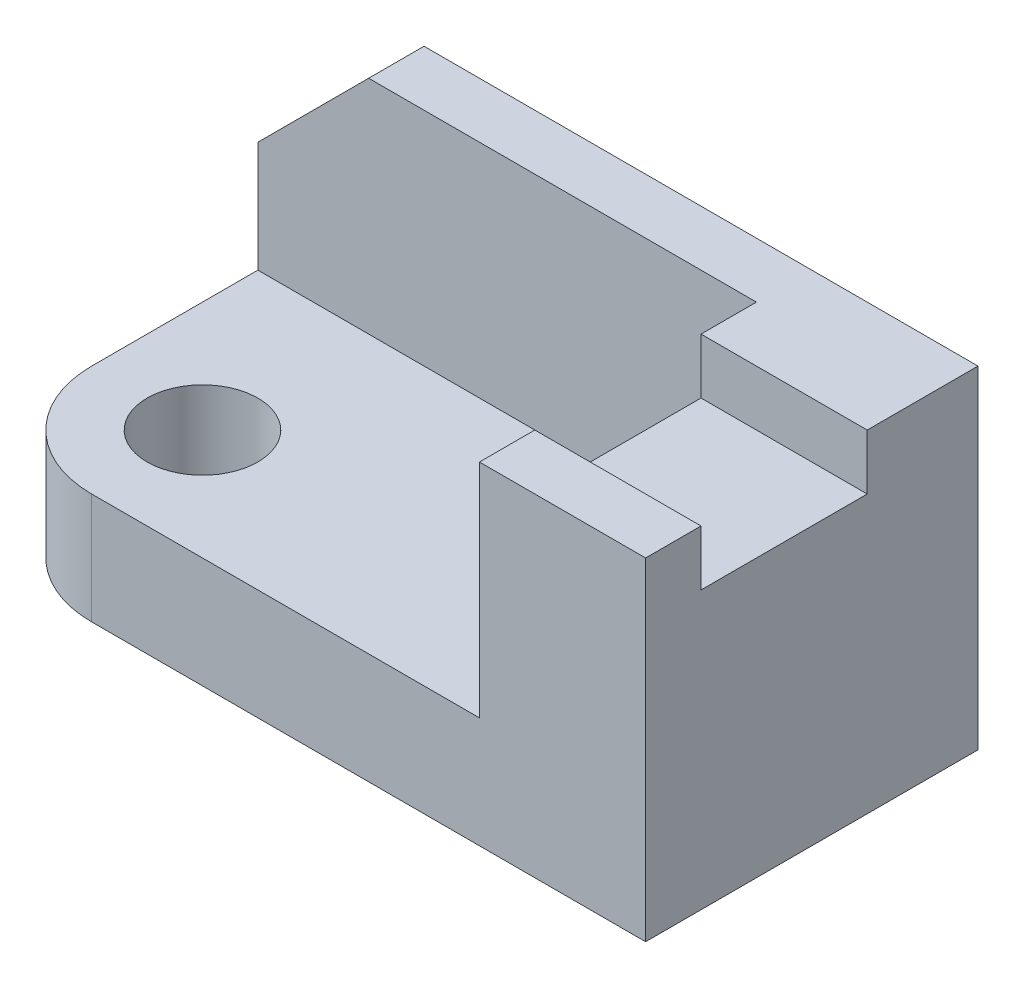
ISO-10303-21;
HEADER;
FILE_DESCRIPTION(('STEP AP214'),'2;1');
FILE_NAME('part.step','',(''),(''),'','','');
FILE_SCHEMA(('AUTOMOTIVE_DESIGN { 1 0 10303 214 1 1 1 1 }'));
ENDSEC;
DATA;
#1=APPLICATION_CONTEXT('core data for automotive mechanical design processes');
#2=APPLICATION_PROTOCOL_DEFINITION('international standard','automotive_design',2000,#1);
#3=PRODUCT_CONTEXT('',#1,'mechanical');
#4=PRODUCT('Part','Part','',(#3));
#5=PRODUCT_RELATED_PRODUCT_CATEGORY('part','',(#4));
#6=PRODUCT_DEFINITION_FORMATION('','',#4);
#7=PRODUCT_DEFINITION_CONTEXT('part definition',#1,'design');
#8=PRODUCT_DEFINITION('design','',#6,#7);
#9=PRODUCT_DEFINITION_SHAPE('','',#8);
#10=(LENGTH_UNIT() NAMED_UNIT(*) SI_UNIT(.MILLI.,.METRE.));
#11=(NAMED_UNIT(*) PLANE_ANGLE_UNIT() SI_UNIT($,.RADIAN.));
#12=(NAMED_UNIT(*) SI_UNIT($,.STERADIAN.) SOLID_ANGLE_UNIT());
#13=UNCERTAINTY_MEASURE_WITH_UNIT(LENGTH_MEASURE(1.E-05),#10,'distance_accuracy_value','');
#14=(GEOMETRIC_REPRESENTATION_CONTEXT(3) GLOBAL_UNCERTAINTY_ASSIGNED_CONTEXT((#13)) GLOBAL_UNIT_ASSIGNED_CONTEXT((#10,
#11,#12)) REPRESENTATION_CONTEXT('',''));
#15=CARTESIAN_POINT('',(0.,0.,0.));
#16=DIRECTION('',(0.,0.,1.));
#17=DIRECTION('',(1.,0.,0.));
#18=AXIS2_PLACEMENT_3D('',#15,#16,#17);
#19=CARTESIAN_POINT('',(0.,40.,0.));
#20=DIRECTION('',(0.,1.,0.));
#21=DIRECTION('',(0.,0.,1.));
#22=AXIS2_PLACEMENT_3D('',#19,#20,#21);
#23=PLANE('',#22);
#24=DIRECTION('',(-1.,0.,0.));
#25=VECTOR('',#24,1.);
#26=CARTESIAN_POINT('',(-30.,40.,20.));
#27=LINE('',#26,#25);
#28=CARTESIAN_POINT('',(0.,40.,20.));
#29=VERTEX_POINT('',#28);
#30=CARTESIAN_POINT('',(-30.,40.,20.));
#31=VERTEX_POINT('',#30);
#32=EDGE_CURVE('E151',#29,#31,#27,.T.);
#33=ORIENTED_EDGE('',*,*,#32,.F.);
#34=DIRECTION('',(0.,0.,-1.));
#35=VECTOR('',#34,1.);
#36=CARTESIAN_POINT('',(0.,40.,0.));
#37=LINE('',#36,#35);
#38=CARTESIAN_POINT('',(0.,40.,0.));
#39=VERTEX_POINT('',#38);
#40=EDGE_CURVE('E172',#29,#39,#37,.T.);
#41=ORIENTED_EDGE('',*,*,#40,.T.);
#42=DIRECTION('',(-1.,0.,0.));
#43=VECTOR('',#42,1.);
#44=CARTESIAN_POINT('',(-120.,40.,0.));
#45=LINE('',#44,#43);
#46=CARTESIAN_POINT('',(-100.,40.,0.));
#47=VERTEX_POINT('',#46);
#48=EDGE_CURVE('E176',#39,#47,#45,.T.);
#49=ORIENTED_EDGE('',*,*,#48,.T.);
#50=DIRECTION('',(0.,0.,1.));
#51=VECTOR('',#50,1.);
#52=CARTESIAN_POINT('',(-100.,40.,0.));
#53=LINE('',#52,#51);
#54=CARTESIAN_POINT('',(-100.,40.,10.));
#55=VERTEX_POINT('',#54);
#56=EDGE_CURVE('E225',#47,#55,#53,.T.);
#57=ORIENTED_EDGE('',*,*,#56,.T.);
#58=DIRECTION('',(1.,0.,0.));
#59=VECTOR('',#58,1.);
#60=CARTESIAN_POINT('',(-120.,40.,10.));
#61=LINE('',#60,#59);
#62=CARTESIAN_POINT('',(-30.,40.,10.));
#63=VERTEX_POINT('',#62);
#64=EDGE_CURVE('E163',#55,#63,#61,.T.);
#65=ORIENTED_EDGE('',*,*,#64,.T.);
#66=DIRECTION('',(0.,0.,1.));
#67=VECTOR('',#66,1.);
#68=CARTESIAN_POINT('',(-30.,40.,10.));
#69=LINE('',#68,#67);
#70=EDGE_CURVE('E166',#63,#31,#69,.T.);
#71=ORIENTED_EDGE('',*,*,#70,.T.);
#72=EDGE_LOOP('',(#33,#41,#49,#57,#65,#71));
#73=FACE_BOUND('',#72,.T.);
#74=ADVANCED_FACE('F41',(#73),#23,.T.);
#75=CARTESIAN_POINT('',(0.,0.,0.));
#76=DIRECTION('',(0.,-1.,0.));
#77=DIRECTION('',(0.,0.,-1.));
#78=AXIS2_PLACEMENT_3D('',#75,#76,#77);
#79=PLANE('',#78);
#80=CARTESIAN_POINT('',(-100.,0.,40.));
#81=DIRECTION('',(0.,1.,0.));
#82=DIRECTION('',(0.,0.,1.));
#83=AXIS2_PLACEMENT_3D('',#80,#81,#82);
#84=CIRCLE('',#83,9.99999999999999);
#85=CARTESIAN_POINT('',(-100.,0.,50.));
#86=VERTEX_POINT('',#85);
#87=EDGE_CURVE('E275',#86,#86,#84,.T.);
#88=ORIENTED_EDGE('',*,*,#87,.F.);
#89=EDGE_LOOP('',(#88));
#90=FACE_BOUND('',#89,.T.);
#91=DIRECTION('',(0.,0.,1.));
#92=VECTOR('',#91,1.);
#93=CARTESIAN_POINT('',(-120.,0.,0.));
#94=LINE('',#93,#92);
#95=CARTESIAN_POINT('',(-120.,0.,10.));
#96=VERTEX_POINT('',#95);
#97=CARTESIAN_POINT('',(-120.,0.,40.));
#98=VERTEX_POINT('',#97);
#99=EDGE_CURVE('E193',#96,#98,#94,.T.);
#100=ORIENTED_EDGE('',*,*,#99,.T.);
#101=CARTESIAN_POINT('',(-100.,0.,40.));
#102=DIRECTION('',(0.,-1.,0.));
#103=DIRECTION('',(0.,0.,-1.));
#104=AXIS2_PLACEMENT_3D('',#101,#102,#103);
#105=CIRCLE('',#104,20.);
#106=CARTESIAN_POINT('',(-100.,0.,60.));
#107=VERTEX_POINT('',#106);
#108=EDGE_CURVE('E219',#98,#107,#105,.F.);
#109=ORIENTED_EDGE('',*,*,#108,.T.);
#110=DIRECTION('',(1.,0.,0.));
#111=VECTOR('',#110,1.);
#112=CARTESIAN_POINT('',(0.,0.,60.));
#113=LINE('',#112,#111);
#114=CARTESIAN_POINT('',(-30.,0.,60.));
#115=VERTEX_POINT('',#114);
#116=EDGE_CURVE('E198',#107,#115,#113,.T.);
#117=ORIENTED_EDGE('',*,*,#116,.T.);
#118=DIRECTION('',(0.,0.,1.));
#119=VECTOR('',#118,1.);
#120=CARTESIAN_POINT('',(-30.,0.,10.));
#121=LINE('',#120,#119);
#122=CARTESIAN_POINT('',(-30.,0.,10.));
#123=VERTEX_POINT('',#122);
#124=EDGE_CURVE('E165',#123,#115,#121,.T.);
#125=ORIENTED_EDGE('',*,*,#124,.F.);
#126=DIRECTION('',(1.,0.,0.));
#127=VECTOR('',#126,1.);
#128=CARTESIAN_POINT('',(-120.,0.,10.));
#129=LINE('',#128,#127);
#130=EDGE_CURVE('E180',#96,#123,#129,.T.);
#131=ORIENTED_EDGE('',*,*,#130,.F.);
#132=EDGE_LOOP('',(#100,#109,#117,#125,#131));
#133=FACE_BOUND('',#132,.T.);
#134=ADVANCED_FACE('F262',(#90,#133),#79,.F.);
#135=CARTESIAN_POINT('',(0.,-20.,0.));
#136=DIRECTION('',(1.,0.,0.));
#137=DIRECTION('',(0.,0.,-1.));
#138=AXIS2_PLACEMENT_3D('',#135,#136,#137);
#139=PLANE('',#138);
#140=DIRECTION('',(0.,1.,0.));
#141=VECTOR('',#140,1.);
#142=CARTESIAN_POINT('',(0.,30.,20.));
#143=LINE('',#142,#141);
#144=CARTESIAN_POINT('',(0.,30.,20.));
#145=VERTEX_POINT('',#144);
#146=EDGE_CURVE('E158',#145,#29,#143,.T.);
#147=ORIENTED_EDGE('',*,*,#146,.F.);
#148=DIRECTION('',(0.,0.,-1.));
#149=VECTOR('',#148,1.);
#150=CARTESIAN_POINT('',(0.,30.,20.));
#151=LINE('',#150,#149);
#152=CARTESIAN_POINT('',(0.,30.,50.));
#153=VERTEX_POINT('',#152);
#154=EDGE_CURVE('E141',#153,#145,#151,.T.);
#155=ORIENTED_EDGE('',*,*,#154,.F.);
#156=DIRECTION('',(0.,1.,0.));
#157=VECTOR('',#156,1.);
#158=CARTESIAN_POINT('',(0.,30.,50.));
#159=LINE('',#158,#157);
#160=CARTESIAN_POINT('',(0.,40.,50.));
#161=VERTEX_POINT('',#160);
#162=EDGE_CURVE('E138',#153,#161,#159,.T.);
#163=ORIENTED_EDGE('',*,*,#162,.T.);
#164=CARTESIAN_POINT('',(0.,40.,60.));
#165=VERTEX_POINT('',#164);
#166=EDGE_CURVE('E173',#165,#161,#37,.T.);
#167=ORIENTED_EDGE('',*,*,#166,.F.);
#168=DIRECTION('',(0.,1.,0.));
#169=VECTOR('',#168,1.);
#170=CARTESIAN_POINT('',(0.,-20.,60.));
#171=LINE('',#170,#169);
#172=CARTESIAN_POINT('',(0.,-20.,60.));
#173=VERTEX_POINT('',#172);
#174=EDGE_CURVE('E210',#173,#165,#171,.T.);
#175=ORIENTED_EDGE('',*,*,#174,.F.);
#176=DIRECTION('',(0.,0.,-1.));
#177=VECTOR('',#176,1.);
#178=CARTESIAN_POINT('',(0.,-20.,0.));
#179=LINE('',#178,#177);
#180=CARTESIAN_POINT('',(0.,-20.,0.));
#181=VERTEX_POINT('',#180);
#182=EDGE_CURVE('E194',#173,#181,#179,.T.);
#183=ORIENTED_EDGE('',*,*,#182,.T.);
#184=DIRECTION('',(0.,1.,0.));
#185=VECTOR('',#184,1.);
#186=CARTESIAN_POINT('',(0.,-20.,0.));
#187=LINE('',#186,#185);
#188=EDGE_CURVE('E206',#181,#39,#187,.T.);
#189=ORIENTED_EDGE('',*,*,#188,.T.);
#190=ORIENTED_EDGE('',*,*,#40,.F.);
#191=EDGE_LOOP('',(#147,#155,#163,#167,#175,#183,#189,#190));
#192=FACE_BOUND('',#191,.T.);
#193=ADVANCED_FACE('F247',(#192),#139,.T.);
#194=CARTESIAN_POINT('',(0.,-20.,60.));
#195=DIRECTION('',(0.,0.,1.));
#196=DIRECTION('',(1.,0.,0.));
#197=AXIS2_PLACEMENT_3D('',#194,#195,#196);
#198=PLANE('',#197);
#199=ORIENTED_EDGE('',*,*,#116,.F.);
#200=DIRECTION('',(0.,1.,0.));
#201=VECTOR('',#200,1.);
#202=CARTESIAN_POINT('',(-100.,-20.,60.));
#203=LINE('',#202,#201);
#204=CARTESIAN_POINT('',(-100.,-20.,60.));
#205=VERTEX_POINT('',#204);
#206=EDGE_CURVE('E221',#107,#205,#203,.F.);
#207=ORIENTED_EDGE('',*,*,#206,.T.);
#208=DIRECTION('',(1.,0.,0.));
#209=VECTOR('',#208,1.);
#210=CARTESIAN_POINT('',(0.,-20.,60.));
#211=LINE('',#210,#209);
#212=EDGE_CURVE('E204',#205,#173,#211,.T.);
#213=ORIENTED_EDGE('',*,*,#212,.T.);
#214=ORIENTED_EDGE('',*,*,#174,.T.);
#215=DIRECTION('',(1.,0.,0.));
#216=VECTOR('',#215,1.);
#217=CARTESIAN_POINT('',(-30.,40.,60.));
#218=LINE('',#217,#216);
#219=CARTESIAN_POINT('',(-30.,40.,60.));
#220=VERTEX_POINT('',#219);
#221=EDGE_CURVE('E169',#220,#165,#218,.T.);
#222=ORIENTED_EDGE('',*,*,#221,.F.);
#223=DIRECTION('',(0.,-1.,0.));
#224=VECTOR('',#223,1.);
#225=CARTESIAN_POINT('',(-30.,40.,60.));
#226=LINE('',#225,#224);
#227=EDGE_CURVE('E179',#220,#115,#226,.T.);
#228=ORIENTED_EDGE('',*,*,#227,.T.);
#229=EDGE_LOOP('',(#199,#207,#213,#214,#222,#228));
#230=FACE_BOUND('',#229,.T.);
#231=ADVANCED_FACE('F264',(#230),#198,.T.);
#232=CARTESIAN_POINT('',(-120.,-20.,0.));
#233=DIRECTION('',(-1.,0.,0.));
#234=DIRECTION('',(0.,0.,1.));
#235=AXIS2_PLACEMENT_3D('',#232,#233,#234);
#236=PLANE('',#235);
#237=DIRECTION('',(0.,-1.,0.));
#238=VECTOR('',#237,1.);
#239=CARTESIAN_POINT('',(-120.,40.,10.));
#240=LINE('',#239,#238);
#241=CARTESIAN_POINT('',(-120.,19.9999999999999,10.));
#242=VERTEX_POINT('',#241);
#243=EDGE_CURVE('E191',#242,#96,#240,.T.);
#244=ORIENTED_EDGE('',*,*,#243,.F.);
#245=DIRECTION('',(0.,0.,-1.));
#246=VECTOR('',#245,1.);
#247=CARTESIAN_POINT('',(-120.,19.9999999999999,0.));
#248=LINE('',#247,#246);
#249=CARTESIAN_POINT('',(-120.,19.9999999999999,0.));
#250=VERTEX_POINT('',#249);
#251=EDGE_CURVE('E50',#242,#250,#248,.T.);
#252=ORIENTED_EDGE('',*,*,#251,.T.);
#253=DIRECTION('',(0.,1.,0.));
#254=VECTOR('',#253,1.);
#255=CARTESIAN_POINT('',(-120.,-20.,0.));
#256=LINE('',#255,#254);
#257=CARTESIAN_POINT('',(-120.,-20.,0.));
#258=VERTEX_POINT('',#257);
#259=EDGE_CURVE('E213',#258,#250,#256,.T.);
#260=ORIENTED_EDGE('',*,*,#259,.F.);
#261=DIRECTION('',(0.,0.,1.));
#262=VECTOR('',#261,1.);
#263=CARTESIAN_POINT('',(-120.,-20.,0.));
#264=LINE('',#263,#262);
#265=CARTESIAN_POINT('',(-120.,-20.,40.));
#266=VERTEX_POINT('',#265);
#267=EDGE_CURVE('E201',#258,#266,#264,.T.);
#268=ORIENTED_EDGE('',*,*,#267,.T.);
#269=DIRECTION('',(0.,1.,0.));
#270=VECTOR('',#269,1.);
#271=CARTESIAN_POINT('',(-120.,-20.,40.));
#272=LINE('',#271,#270);
#273=EDGE_CURVE('E212',#266,#98,#272,.T.);
#274=ORIENTED_EDGE('',*,*,#273,.T.);
#275=ORIENTED_EDGE('',*,*,#99,.F.);
#276=EDGE_LOOP('',(#244,#252,#260,#268,#274,#275));
#277=FACE_BOUND('',#276,.T.);
#278=ADVANCED_FACE('F237',(#277),#236,.T.);
#279=CARTESIAN_POINT('',(0.,-20.,0.));
#280=DIRECTION('',(0.,0.,-1.));
#281=DIRECTION('',(-1.,0.,0.));
#282=AXIS2_PLACEMENT_3D('',#279,#280,#281);
#283=PLANE('',#282);
#284=ORIENTED_EDGE('',*,*,#259,.T.);
#285=DIRECTION('',(-0.707106781186546,-0.707106781186549,0.));
#286=VECTOR('',#285,1.);
#287=CARTESIAN_POINT('',(-80.0000000000002,59.9999999999999,0.));
#288=LINE('',#287,#286);
#289=EDGE_CURVE('E11',#250,#47,#288,.F.);
#290=ORIENTED_EDGE('',*,*,#289,.T.);
#291=ORIENTED_EDGE('',*,*,#48,.F.);
#292=ORIENTED_EDGE('',*,*,#188,.F.);
#293=DIRECTION('',(-1.,0.,0.));
#294=VECTOR('',#293,1.);
#295=CARTESIAN_POINT('',(0.,-20.,0.));
#296=LINE('',#295,#294);
#297=EDGE_CURVE('E197',#181,#258,#296,.T.);
#298=ORIENTED_EDGE('',*,*,#297,.T.);
#299=EDGE_LOOP('',(#284,#290,#291,#292,#298));
#300=FACE_BOUND('',#299,.T.);
#301=ADVANCED_FACE('F241',(#300),#283,.T.);
#302=CARTESIAN_POINT('',(0.,-20.,0.));
#303=DIRECTION('',(0.,-1.,0.));
#304=DIRECTION('',(0.,0.,-1.));
#305=AXIS2_PLACEMENT_3D('',#302,#303,#304);
#306=PLANE('',#305);
#307=CARTESIAN_POINT('',(-100.,-20.,40.));
#308=DIRECTION('',(0.,1.,0.));
#309=DIRECTION('',(0.,0.,1.));
#310=AXIS2_PLACEMENT_3D('',#307,#308,#309);
#311=CIRCLE('',#310,9.99999999999999);
#312=CARTESIAN_POINT('',(-100.,-20.,50.));
#313=VERTEX_POINT('',#312);
#314=EDGE_CURVE('E272',#313,#313,#311,.T.);
#315=ORIENTED_EDGE('',*,*,#314,.T.);
#316=EDGE_LOOP('',(#315));
#317=FACE_BOUND('',#316,.T.);
#318=ORIENTED_EDGE('',*,*,#212,.F.);
#319=CARTESIAN_POINT('',(-100.,-20.,40.));
#320=DIRECTION('',(0.,-1.,0.));
#321=DIRECTION('',(0.,0.,-1.));
#322=AXIS2_PLACEMENT_3D('',#319,#320,#321);
#323=CIRCLE('',#322,20.);
#324=EDGE_CURVE('E223',#205,#266,#323,.T.);
#325=ORIENTED_EDGE('',*,*,#324,.T.);
#326=ORIENTED_EDGE('',*,*,#267,.F.);
#327=ORIENTED_EDGE('',*,*,#297,.F.);
#328=ORIENTED_EDGE('',*,*,#182,.F.);
#329=EDGE_LOOP('',(#318,#325,#326,#327,#328));
#330=FACE_BOUND('',#329,.T.);
#331=ADVANCED_FACE('F254',(#317,#330),#306,.T.);
#332=CARTESIAN_POINT('',(-120.,40.,10.));
#333=DIRECTION('',(0.,0.,-1.));
#334=DIRECTION('',(-1.,0.,0.));
#335=AXIS2_PLACEMENT_3D('',#332,#333,#334);
#336=PLANE('',#335);
#337=ORIENTED_EDGE('',*,*,#64,.F.);
#338=DIRECTION('',(0.707106781186546,0.707106781186549,0.));
#339=VECTOR('',#338,1.);
#340=CARTESIAN_POINT('',(-100.,40.,10.));
#341=LINE('',#340,#339);
#342=EDGE_CURVE('E228',#55,#242,#341,.F.);
#343=ORIENTED_EDGE('',*,*,#342,.T.);
#344=ORIENTED_EDGE('',*,*,#243,.T.);
#345=ORIENTED_EDGE('',*,*,#130,.T.);
#346=DIRECTION('',(0.,-1.,0.));
#347=VECTOR('',#346,1.);
#348=CARTESIAN_POINT('',(-30.,40.,10.));
#349=LINE('',#348,#347);
#350=EDGE_CURVE('E188',#63,#123,#349,.T.);
#351=ORIENTED_EDGE('',*,*,#350,.F.);
#352=EDGE_LOOP('',(#337,#343,#344,#345,#351));
#353=FACE_BOUND('',#352,.T.);
#354=ADVANCED_FACE('F231',(#353),#336,.F.);
#355=CARTESIAN_POINT('',(-30.,40.,10.));
#356=DIRECTION('',(1.,0.,0.));
#357=DIRECTION('',(0.,0.,-1.));
#358=AXIS2_PLACEMENT_3D('',#355,#356,#357);
#359=PLANE('',#358);
#360=DIRECTION('',(0.,0.,1.));
#361=VECTOR('',#360,1.);
#362=CARTESIAN_POINT('',(-30.,30.,20.));
#363=LINE('',#362,#361);
#364=CARTESIAN_POINT('',(-30.,30.,20.));
#365=VERTEX_POINT('',#364);
#366=CARTESIAN_POINT('',(-30.,30.,50.));
#367=VERTEX_POINT('',#366);
#368=EDGE_CURVE('E142',#365,#367,#363,.T.);
#369=ORIENTED_EDGE('',*,*,#368,.F.);
#370=DIRECTION('',(0.,1.,0.));
#371=VECTOR('',#370,1.);
#372=CARTESIAN_POINT('',(-30.,30.,20.));
#373=LINE('',#372,#371);
#374=EDGE_CURVE('E183',#365,#31,#373,.T.);
#375=ORIENTED_EDGE('',*,*,#374,.T.);
#376=ORIENTED_EDGE('',*,*,#70,.F.);
#377=ORIENTED_EDGE('',*,*,#350,.T.);
#378=ORIENTED_EDGE('',*,*,#124,.T.);
#379=ORIENTED_EDGE('',*,*,#227,.F.);
#380=CARTESIAN_POINT('',(-30.,40.,50.));
#381=VERTEX_POINT('',#380);
#382=EDGE_CURVE('E156',#381,#220,#69,.T.);
#383=ORIENTED_EDGE('',*,*,#382,.F.);
#384=DIRECTION('',(0.,1.,0.));
#385=VECTOR('',#384,1.);
#386=CARTESIAN_POINT('',(-30.,30.,50.));
#387=LINE('',#386,#385);
#388=EDGE_CURVE('E57',#367,#381,#387,.T.);
#389=ORIENTED_EDGE('',*,*,#388,.F.);
#390=EDGE_LOOP('',(#369,#375,#376,#377,#378,#379,#383,#389));
#391=FACE_BOUND('',#390,.T.);
#392=ADVANCED_FACE('F154',(#391),#359,.F.);
#393=DIRECTION('',(1.,0.,0.));
#394=VECTOR('',#393,1.);
#395=CARTESIAN_POINT('',(-30.,40.,50.));
#396=LINE('',#395,#394);
#397=EDGE_CURVE('E271',#381,#161,#396,.T.);
#398=ORIENTED_EDGE('',*,*,#397,.F.);
#399=ORIENTED_EDGE('',*,*,#382,.T.);
#400=ORIENTED_EDGE('',*,*,#221,.T.);
#401=ORIENTED_EDGE('',*,*,#166,.T.);
#402=EDGE_LOOP('',(#398,#399,#400,#401));
#403=FACE_BOUND('',#402,.T.);
#404=ADVANCED_FACE('F296',(#403),#23,.T.);
#405=CARTESIAN_POINT('',(-100.,-20.,40.));
#406=DIRECTION('',(0.,1.,0.));
#407=DIRECTION('',(0.,0.,1.));
#408=AXIS2_PLACEMENT_3D('',#405,#406,#407);
#409=CYLINDRICAL_SURFACE('',#408,20.);
#410=ORIENTED_EDGE('',*,*,#324,.F.);
#411=ORIENTED_EDGE('',*,*,#206,.F.);
#412=ORIENTED_EDGE('',*,*,#108,.F.);
#413=ORIENTED_EDGE('',*,*,#273,.F.);
#414=EDGE_LOOP('',(#410,#411,#412,#413));
#415=FACE_BOUND('',#414,.T.);
#416=ADVANCED_FACE('F258',(#415),#409,.T.);
#417=CARTESIAN_POINT('',(-100.,40.,0.));
#418=DIRECTION('',(0.707106781186549,-0.707106781186546,0.));
#419=DIRECTION('',(0.,0.,1.));
#420=AXIS2_PLACEMENT_3D('',#417,#418,#419);
#421=PLANE('',#420);
#422=ORIENTED_EDGE('',*,*,#289,.F.);
#423=ORIENTED_EDGE('',*,*,#251,.F.);
#424=ORIENTED_EDGE('',*,*,#342,.F.);
#425=ORIENTED_EDGE('',*,*,#56,.F.);
#426=EDGE_LOOP('',(#422,#423,#424,#425));
#427=FACE_BOUND('',#426,.T.);
#428=ADVANCED_FACE('F44',(#427),#421,.F.);
#429=CARTESIAN_POINT('',(-30.,30.,20.));
#430=DIRECTION('',(0.,0.,-1.));
#431=DIRECTION('',(-1.,0.,0.));
#432=AXIS2_PLACEMENT_3D('',#429,#430,#431);
#433=PLANE('',#432);
#434=ORIENTED_EDGE('',*,*,#32,.T.);
#435=ORIENTED_EDGE('',*,*,#374,.F.);
#436=DIRECTION('',(-1.,0.,0.));
#437=VECTOR('',#436,1.);
#438=CARTESIAN_POINT('',(-30.,30.,20.));
#439=LINE('',#438,#437);
#440=EDGE_CURVE('E148',#145,#365,#439,.T.);
#441=ORIENTED_EDGE('',*,*,#440,.F.);
#442=ORIENTED_EDGE('',*,*,#146,.T.);
#443=EDGE_LOOP('',(#434,#435,#441,#442));
#444=FACE_BOUND('',#443,.T.);
#445=ADVANCED_FACE('F310',(#444),#433,.F.);
#446=CARTESIAN_POINT('',(-30.,30.,50.));
#447=DIRECTION('',(0.,0.,1.));
#448=DIRECTION('',(1.,0.,0.));
#449=AXIS2_PLACEMENT_3D('',#446,#447,#448);
#450=PLANE('',#449);
#451=ORIENTED_EDGE('',*,*,#397,.T.);
#452=ORIENTED_EDGE('',*,*,#162,.F.);
#453=DIRECTION('',(1.,0.,0.));
#454=VECTOR('',#453,1.);
#455=CARTESIAN_POINT('',(-30.,30.,50.));
#456=LINE('',#455,#454);
#457=EDGE_CURVE('E134',#367,#153,#456,.T.);
#458=ORIENTED_EDGE('',*,*,#457,.F.);
#459=ORIENTED_EDGE('',*,*,#388,.T.);
#460=EDGE_LOOP('',(#451,#452,#458,#459));
#461=FACE_BOUND('',#460,.T.);
#462=ADVANCED_FACE('F136',(#461),#450,.F.);
#463=CARTESIAN_POINT('',(0.,30.,0.));
#464=DIRECTION('',(0.,1.,0.));
#465=DIRECTION('',(0.,0.,1.));
#466=AXIS2_PLACEMENT_3D('',#463,#464,#465);
#467=PLANE('',#466);
#468=ORIENTED_EDGE('',*,*,#368,.T.);
#469=ORIENTED_EDGE('',*,*,#457,.T.);
#470=ORIENTED_EDGE('',*,*,#154,.T.);
#471=ORIENTED_EDGE('',*,*,#440,.T.);
#472=EDGE_LOOP('',(#468,#469,#470,#471));
#473=FACE_BOUND('',#472,.T.);
#474=ADVANCED_FACE('F146',(#473),#467,.T.);
#475=CARTESIAN_POINT('',(-100.,-20.,40.));
#476=DIRECTION('',(0.,1.,0.));
#477=DIRECTION('',(0.,0.,1.));
#478=AXIS2_PLACEMENT_3D('',#475,#476,#477);
#479=CYLINDRICAL_SURFACE('',#478,9.99999999999999);
#480=ORIENTED_EDGE('',*,*,#314,.F.);
#481=EDGE_LOOP('',(#480));
#482=FACE_BOUND('',#481,.T.);
#483=ORIENTED_EDGE('',*,*,#87,.T.);
#484=EDGE_LOOP('',(#483));
#485=FACE_BOUND('',#484,.T.);
#486=ADVANCED_FACE('F282',(#482,#485),#479,.F.);
#487=CLOSED_SHELL('',(#74,#134,#193,#231,#278,#301,#331,#354,#392,#404,#416,#428,#445,#462,#474,#486));
#488=MANIFOLD_SOLID_BREP('B2',#487);
#489=ADVANCED_BREP_SHAPE_REPRESENTATION('',(#18,#488),#14);
#490=SHAPE_DEFINITION_REPRESENTATION(#9,#489);
ENDSEC;
END-ISO-10303-21;
